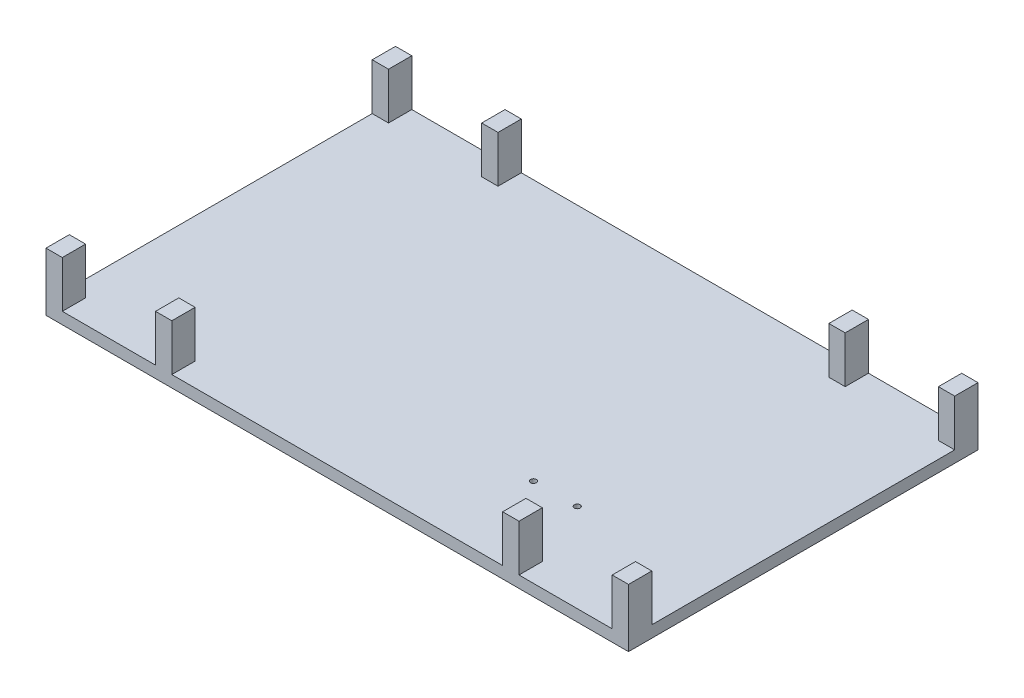
ISO-10303-21;
HEADER;
FILE_DESCRIPTION(('STEP AP214'),'2;1');
FILE_NAME('part.step','',(''),(''),'','','');
FILE_SCHEMA(('AUTOMOTIVE_DESIGN { 1 0 10303 214 1 1 1 1 }'));
ENDSEC;
DATA;
#1=APPLICATION_CONTEXT('core data for automotive mechanical design processes');
#2=APPLICATION_PROTOCOL_DEFINITION('international standard','automotive_design',2000,#1);
#3=PRODUCT_CONTEXT('',#1,'mechanical');
#4=PRODUCT('Part','Part','',(#3));
#5=PRODUCT_RELATED_PRODUCT_CATEGORY('part','',(#4));
#6=PRODUCT_DEFINITION_FORMATION('','',#4);
#7=PRODUCT_DEFINITION_CONTEXT('part definition',#1,'design');
#8=PRODUCT_DEFINITION('design','',#6,#7);
#9=PRODUCT_DEFINITION_SHAPE('','',#8);
#10=(LENGTH_UNIT() NAMED_UNIT(*) SI_UNIT(.MILLI.,.METRE.));
#11=(NAMED_UNIT(*) PLANE_ANGLE_UNIT() SI_UNIT($,.RADIAN.));
#12=(NAMED_UNIT(*) SI_UNIT($,.STERADIAN.) SOLID_ANGLE_UNIT());
#13=UNCERTAINTY_MEASURE_WITH_UNIT(LENGTH_MEASURE(1.E-05),#10,'distance_accuracy_value','');
#14=(GEOMETRIC_REPRESENTATION_CONTEXT(3) GLOBAL_UNCERTAINTY_ASSIGNED_CONTEXT((#13)) GLOBAL_UNIT_ASSIGNED_CONTEXT((#10,
#11,#12)) REPRESENTATION_CONTEXT('',''));
#15=CARTESIAN_POINT('',(0.,0.,0.));
#16=DIRECTION('',(0.,0.,1.));
#17=DIRECTION('',(1.,0.,0.));
#18=AXIS2_PLACEMENT_3D('',#15,#16,#17);
#19=CARTESIAN_POINT('',(0.,5.,0.));
#20=DIRECTION('',(0.,-1.,0.));
#21=DIRECTION('',(0.,0.,-1.));
#22=AXIS2_PLACEMENT_3D('',#19,#20,#21);
#23=PLANE('',#22);
#24=CARTESIAN_POINT('',(46.2,5.,37.));
#25=DIRECTION('',(0.,1.,0.));
#26=DIRECTION('',(0.,0.,1.));
#27=AXIS2_PLACEMENT_3D('',#24,#25,#26);
#28=CIRCLE('',#27,1.25);
#29=CARTESIAN_POINT('',(46.2,5.,38.25));
#30=VERTEX_POINT('',#29);
#31=EDGE_CURVE('E692',#30,#30,#28,.T.);
#32=ORIENTED_EDGE('',*,*,#31,.F.);
#33=EDGE_LOOP('',(#32));
#34=FACE_BOUND('',#33,.T.);
#35=CARTESIAN_POINT('',(65.,5.,37.));
#36=DIRECTION('',(0.,1.,0.));
#37=DIRECTION('',(0.,0.,1.));
#38=AXIS2_PLACEMENT_3D('',#35,#36,#37);
#39=CIRCLE('',#38,1.25);
#40=CARTESIAN_POINT('',(65.,5.,38.25));
#41=VERTEX_POINT('',#40);
#42=EDGE_CURVE('E684',#41,#41,#39,.T.);
#43=ORIENTED_EDGE('',*,*,#42,.F.);
#44=EDGE_LOOP('',(#43));
#45=FACE_BOUND('',#44,.T.);
#46=DIRECTION('',(0.,0.,-1.));
#47=VECTOR('',#46,1.);
#48=CARTESIAN_POINT('',(78.,5.,75.));
#49=LINE('',#48,#47);
#50=CARTESIAN_POINT('',(78.,5.,75.));
#51=VERTEX_POINT('',#50);
#52=CARTESIAN_POINT('',(78.,5.,65.));
#53=VERTEX_POINT('',#52);
#54=EDGE_CURVE('E271',#51,#53,#49,.T.);
#55=ORIENTED_EDGE('',*,*,#54,.F.);
#56=DIRECTION('',(1.,0.,0.));
#57=VECTOR('',#56,1.);
#58=CARTESIAN_POINT('',(125.,5.,75.));
#59=LINE('',#58,#57);
#60=CARTESIAN_POINT('',(118.,5.,75.));
#61=VERTEX_POINT('',#60);
#62=EDGE_CURVE('E540',#51,#61,#59,.T.);
#63=ORIENTED_EDGE('',*,*,#62,.T.);
#64=DIRECTION('',(0.,0.,1.));
#65=VECTOR('',#64,1.);
#66=CARTESIAN_POINT('',(118.,5.,75.));
#67=LINE('',#66,#65);
#68=CARTESIAN_POINT('',(118.,5.,65.));
#69=VERTEX_POINT('',#68);
#70=EDGE_CURVE('E278',#69,#61,#67,.T.);
#71=ORIENTED_EDGE('',*,*,#70,.F.);
#72=DIRECTION('',(-1.,0.,0.));
#73=VECTOR('',#72,1.);
#74=CARTESIAN_POINT('',(125.,5.,65.));
#75=LINE('',#74,#73);
#76=CARTESIAN_POINT('',(125.,5.,65.));
#77=VERTEX_POINT('',#76);
#78=EDGE_CURVE('E273',#77,#69,#75,.T.);
#79=ORIENTED_EDGE('',*,*,#78,.F.);
#80=DIRECTION('',(0.,0.,-1.));
#81=VECTOR('',#80,1.);
#82=CARTESIAN_POINT('',(125.,5.,-75.));
#83=LINE('',#82,#81);
#84=CARTESIAN_POINT('',(125.,5.,-65.));
#85=VERTEX_POINT('',#84);
#86=EDGE_CURVE('E545',#77,#85,#83,.T.);
#87=ORIENTED_EDGE('',*,*,#86,.T.);
#88=DIRECTION('',(1.,0.,0.));
#89=VECTOR('',#88,1.);
#90=CARTESIAN_POINT('',(125.,5.,-65.));
#91=LINE('',#90,#89);
#92=CARTESIAN_POINT('',(118.,5.,-65.));
#93=VERTEX_POINT('',#92);
#94=EDGE_CURVE('E360',#93,#85,#91,.T.);
#95=ORIENTED_EDGE('',*,*,#94,.F.);
#96=DIRECTION('',(0.,0.,1.));
#97=VECTOR('',#96,1.);
#98=CARTESIAN_POINT('',(118.,5.,-75.));
#99=LINE('',#98,#97);
#100=CARTESIAN_POINT('',(118.,5.,-75.));
#101=VERTEX_POINT('',#100);
#102=EDGE_CURVE('E354',#101,#93,#99,.T.);
#103=ORIENTED_EDGE('',*,*,#102,.F.);
#104=DIRECTION('',(-1.,0.,0.));
#105=VECTOR('',#104,1.);
#106=CARTESIAN_POINT('',(125.,5.,-75.));
#107=LINE('',#106,#105);
#108=CARTESIAN_POINT('',(78.,5.,-75.));
#109=VERTEX_POINT('',#108);
#110=EDGE_CURVE('E550',#101,#109,#107,.T.);
#111=ORIENTED_EDGE('',*,*,#110,.T.);
#112=DIRECTION('',(0.,0.,-1.));
#113=VECTOR('',#112,1.);
#114=CARTESIAN_POINT('',(78.,5.,-75.));
#115=LINE('',#114,#113);
#116=CARTESIAN_POINT('',(78.,5.,-65.));
#117=VERTEX_POINT('',#116);
#118=EDGE_CURVE('E313',#117,#109,#115,.T.);
#119=ORIENTED_EDGE('',*,*,#118,.F.);
#120=DIRECTION('',(1.,0.,0.));
#121=VECTOR('',#120,1.);
#122=CARTESIAN_POINT('',(78.,5.,-65.));
#123=LINE('',#122,#121);
#124=CARTESIAN_POINT('',(71.,5.,-65.));
#125=VERTEX_POINT('',#124);
#126=EDGE_CURVE('E319',#125,#117,#123,.T.);
#127=ORIENTED_EDGE('',*,*,#126,.F.);
#128=DIRECTION('',(0.,0.,1.));
#129=VECTOR('',#128,1.);
#130=CARTESIAN_POINT('',(71.,5.,-75.));
#131=LINE('',#130,#129);
#132=CARTESIAN_POINT('',(71.,5.,-75.));
#133=VERTEX_POINT('',#132);
#134=EDGE_CURVE('E332',#133,#125,#131,.T.);
#135=ORIENTED_EDGE('',*,*,#134,.F.);
#136=CARTESIAN_POINT('',(-71.,5.,-75.));
#137=VERTEX_POINT('',#136);
#138=EDGE_CURVE('E554',#133,#137,#107,.T.);
#139=ORIENTED_EDGE('',*,*,#138,.T.);
#140=DIRECTION('',(0.,0.,-1.));
#141=VECTOR('',#140,1.);
#142=CARTESIAN_POINT('',(-71.,5.,-75.));
#143=LINE('',#142,#141);
#144=CARTESIAN_POINT('',(-71.,5.,-65.));
#145=VERTEX_POINT('',#144);
#146=EDGE_CURVE('E393',#145,#137,#143,.T.);
#147=ORIENTED_EDGE('',*,*,#146,.F.);
#148=DIRECTION('',(1.,0.,0.));
#149=VECTOR('',#148,1.);
#150=CARTESIAN_POINT('',(-78.,5.,-64.9999999999999));
#151=LINE('',#150,#149);
#152=CARTESIAN_POINT('',(-78.,5.,-64.9999999999999));
#153=VERTEX_POINT('',#152);
#154=EDGE_CURVE('E406',#153,#145,#151,.T.);
#155=ORIENTED_EDGE('',*,*,#154,.F.);
#156=DIRECTION('',(0.,0.,1.));
#157=VECTOR('',#156,1.);
#158=CARTESIAN_POINT('',(-78.,5.,-75.));
#159=LINE('',#158,#157);
#160=CARTESIAN_POINT('',(-78.,5.,-75.));
#161=VERTEX_POINT('',#160);
#162=EDGE_CURVE('E387',#161,#153,#159,.T.);
#163=ORIENTED_EDGE('',*,*,#162,.F.);
#164=CARTESIAN_POINT('',(-118.,5.,-75.));
#165=VERTEX_POINT('',#164);
#166=EDGE_CURVE('E549',#161,#165,#107,.T.);
#167=ORIENTED_EDGE('',*,*,#166,.T.);
#168=DIRECTION('',(0.,0.,-1.));
#169=VECTOR('',#168,1.);
#170=CARTESIAN_POINT('',(-118.,5.,-75.));
#171=LINE('',#170,#169);
#172=CARTESIAN_POINT('',(-118.,5.,-65.));
#173=VERTEX_POINT('',#172);
#174=EDGE_CURVE('E434',#173,#165,#171,.T.);
#175=ORIENTED_EDGE('',*,*,#174,.F.);
#176=DIRECTION('',(1.,0.,0.));
#177=VECTOR('',#176,1.);
#178=CARTESIAN_POINT('',(-125.,5.,-65.));
#179=LINE('',#178,#177);
#180=CARTESIAN_POINT('',(-125.,5.,-65.));
#181=VERTEX_POINT('',#180);
#182=EDGE_CURVE('E428',#181,#173,#179,.T.);
#183=ORIENTED_EDGE('',*,*,#182,.F.);
#184=DIRECTION('',(0.,0.,1.));
#185=VECTOR('',#184,1.);
#186=CARTESIAN_POINT('',(-125.,5.,-75.));
#187=LINE('',#186,#185);
#188=CARTESIAN_POINT('',(-125.,5.,65.));
#189=VERTEX_POINT('',#188);
#190=EDGE_CURVE('E537',#181,#189,#187,.T.);
#191=ORIENTED_EDGE('',*,*,#190,.T.);
#192=DIRECTION('',(-1.,0.,0.));
#193=VECTOR('',#192,1.);
#194=CARTESIAN_POINT('',(-125.,5.,65.));
#195=LINE('',#194,#193);
#196=CARTESIAN_POINT('',(-118.,5.,65.));
#197=VERTEX_POINT('',#196);
#198=EDGE_CURVE('E509',#197,#189,#195,.T.);
#199=ORIENTED_EDGE('',*,*,#198,.F.);
#200=DIRECTION('',(0.,0.,-1.));
#201=VECTOR('',#200,1.);
#202=CARTESIAN_POINT('',(-118.,5.,75.));
#203=LINE('',#202,#201);
#204=CARTESIAN_POINT('',(-118.,5.,75.));
#205=VERTEX_POINT('',#204);
#206=EDGE_CURVE('E503',#205,#197,#203,.T.);
#207=ORIENTED_EDGE('',*,*,#206,.F.);
#208=CARTESIAN_POINT('',(-78.,5.,75.));
#209=VERTEX_POINT('',#208);
#210=EDGE_CURVE('E542',#205,#209,#59,.T.);
#211=ORIENTED_EDGE('',*,*,#210,.T.);
#212=DIRECTION('',(0.,0.,1.));
#213=VECTOR('',#212,1.);
#214=CARTESIAN_POINT('',(-78.,5.,75.));
#215=LINE('',#214,#213);
#216=CARTESIAN_POINT('',(-78.,5.,65.));
#217=VERTEX_POINT('',#216);
#218=EDGE_CURVE('E462',#217,#209,#215,.T.);
#219=ORIENTED_EDGE('',*,*,#218,.F.);
#220=DIRECTION('',(-1.,0.,0.));
#221=VECTOR('',#220,1.);
#222=CARTESIAN_POINT('',(-78.,5.,65.));
#223=LINE('',#222,#221);
#224=CARTESIAN_POINT('',(-71.,5.,65.));
#225=VERTEX_POINT('',#224);
#226=EDGE_CURVE('E468',#225,#217,#223,.T.);
#227=ORIENTED_EDGE('',*,*,#226,.F.);
#228=DIRECTION('',(0.,0.,-1.));
#229=VECTOR('',#228,1.);
#230=CARTESIAN_POINT('',(-71.,5.,75.));
#231=LINE('',#230,#229);
#232=CARTESIAN_POINT('',(-71.,5.,75.));
#233=VERTEX_POINT('',#232);
#234=EDGE_CURVE('E481',#233,#225,#231,.T.);
#235=ORIENTED_EDGE('',*,*,#234,.F.);
#236=CARTESIAN_POINT('',(71.,5.,75.));
#237=VERTEX_POINT('',#236);
#238=EDGE_CURVE('E546',#233,#237,#59,.T.);
#239=ORIENTED_EDGE('',*,*,#238,.T.);
#240=DIRECTION('',(0.,0.,1.));
#241=VECTOR('',#240,1.);
#242=CARTESIAN_POINT('',(71.,5.,75.));
#243=LINE('',#242,#241);
#244=CARTESIAN_POINT('',(71.,5.,65.));
#245=VERTEX_POINT('',#244);
#246=EDGE_CURVE('E60',#245,#237,#243,.T.);
#247=ORIENTED_EDGE('',*,*,#246,.F.);
#248=DIRECTION('',(-1.,0.,0.));
#249=VECTOR('',#248,1.);
#250=CARTESIAN_POINT('',(78.,5.,65.));
#251=LINE('',#250,#249);
#252=EDGE_CURVE('E55',#53,#245,#251,.T.);
#253=ORIENTED_EDGE('',*,*,#252,.F.);
#254=EDGE_LOOP('',(#55,#63,#71,#79,#87,#95,#103,#111,#119,#127,#135,#139,#147,#155,#163,#167,
#175,#183,#191,#199,#207,#211,#219,#227,#235,#239,#247,#253));
#255=FACE_BOUND('',#254,.T.);
#256=ADVANCED_FACE('F39',(#34,#45,#255),#23,.F.);
#257=CARTESIAN_POINT('',(-125.,5.,-75.));
#258=DIRECTION('',(1.,0.,0.));
#259=DIRECTION('',(0.,0.,-1.));
#260=AXIS2_PLACEMENT_3D('',#257,#258,#259);
#261=PLANE('',#260);
#262=DIRECTION('',(0.,0.,1.));
#263=VECTOR('',#262,1.);
#264=CARTESIAN_POINT('',(-125.,0.,-75.));
#265=LINE('',#264,#263);
#266=CARTESIAN_POINT('',(-125.,0.,-75.));
#267=VERTEX_POINT('',#266);
#268=CARTESIAN_POINT('',(-125.,0.,75.));
#269=VERTEX_POINT('',#268);
#270=EDGE_CURVE('E536',#267,#269,#265,.T.);
#271=ORIENTED_EDGE('',*,*,#270,.T.);
#272=DIRECTION('',(0.,-1.,0.));
#273=VECTOR('',#272,1.);
#274=CARTESIAN_POINT('',(-125.,5.,75.));
#275=LINE('',#274,#273);
#276=CARTESIAN_POINT('',(-125.,25.,75.));
#277=VERTEX_POINT('',#276);
#278=EDGE_CURVE('E11',#277,#269,#275,.T.);
#279=ORIENTED_EDGE('',*,*,#278,.F.);
#280=DIRECTION('',(0.,0.,1.));
#281=VECTOR('',#280,1.);
#282=CARTESIAN_POINT('',(-125.,25.,75.));
#283=LINE('',#282,#281);
#284=CARTESIAN_POINT('',(-125.,25.,65.));
#285=VERTEX_POINT('',#284);
#286=EDGE_CURVE('E504',#285,#277,#283,.T.);
#287=ORIENTED_EDGE('',*,*,#286,.F.);
#288=DIRECTION('',(0.,-1.,0.));
#289=VECTOR('',#288,1.);
#290=CARTESIAN_POINT('',(-125.,25.,65.));
#291=LINE('',#290,#289);
#292=EDGE_CURVE('E518',#285,#189,#291,.T.);
#293=ORIENTED_EDGE('',*,*,#292,.T.);
#294=ORIENTED_EDGE('',*,*,#190,.F.);
#295=DIRECTION('',(0.,-1.,0.));
#296=VECTOR('',#295,1.);
#297=CARTESIAN_POINT('',(-125.,25.,-65.));
#298=LINE('',#297,#296);
#299=CARTESIAN_POINT('',(-125.,25.,-65.));
#300=VERTEX_POINT('',#299);
#301=EDGE_CURVE('E458',#300,#181,#298,.T.);
#302=ORIENTED_EDGE('',*,*,#301,.F.);
#303=DIRECTION('',(0.,0.,1.));
#304=VECTOR('',#303,1.);
#305=CARTESIAN_POINT('',(-125.,25.,-75.));
#306=LINE('',#305,#304);
#307=CARTESIAN_POINT('',(-125.,25.,-75.));
#308=VERTEX_POINT('',#307);
#309=EDGE_CURVE('E429',#308,#300,#306,.T.);
#310=ORIENTED_EDGE('',*,*,#309,.F.);
#311=DIRECTION('',(0.,-1.,0.));
#312=VECTOR('',#311,1.);
#313=CARTESIAN_POINT('',(-125.,5.,-75.));
#314=LINE('',#313,#312);
#315=EDGE_CURVE('E553',#308,#267,#314,.T.);
#316=ORIENTED_EDGE('',*,*,#315,.T.);
#317=EDGE_LOOP('',(#271,#279,#287,#293,#294,#302,#310,#316));
#318=FACE_BOUND('',#317,.T.);
#319=ADVANCED_FACE('F41',(#318),#261,.F.);
#320=CARTESIAN_POINT('',(125.,5.,75.));
#321=DIRECTION('',(0.,0.,-1.));
#322=DIRECTION('',(-1.,0.,0.));
#323=AXIS2_PLACEMENT_3D('',#320,#321,#322);
#324=PLANE('',#323);
#325=DIRECTION('',(1.,0.,0.));
#326=VECTOR('',#325,1.);
#327=CARTESIAN_POINT('',(125.,0.,75.));
#328=LINE('',#327,#326);
#329=CARTESIAN_POINT('',(125.,0.,75.));
#330=VERTEX_POINT('',#329);
#331=EDGE_CURVE('E558',#269,#330,#328,.T.);
#332=ORIENTED_EDGE('',*,*,#331,.T.);
#333=DIRECTION('',(0.,-1.,0.));
#334=VECTOR('',#333,1.);
#335=CARTESIAN_POINT('',(125.,5.,75.));
#336=LINE('',#335,#334);
#337=CARTESIAN_POINT('',(125.,25.,75.));
#338=VERTEX_POINT('',#337);
#339=EDGE_CURVE('E48',#338,#330,#336,.T.);
#340=ORIENTED_EDGE('',*,*,#339,.F.);
#341=DIRECTION('',(1.,0.,0.));
#342=VECTOR('',#341,1.);
#343=CARTESIAN_POINT('',(125.,25.,75.));
#344=LINE('',#343,#342);
#345=CARTESIAN_POINT('',(118.,25.,75.));
#346=VERTEX_POINT('',#345);
#347=EDGE_CURVE('E294',#346,#338,#344,.T.);
#348=ORIENTED_EDGE('',*,*,#347,.F.);
#349=DIRECTION('',(0.,-1.,0.));
#350=VECTOR('',#349,1.);
#351=CARTESIAN_POINT('',(118.,25.,75.));
#352=LINE('',#351,#350);
#353=EDGE_CURVE('E297',#346,#61,#352,.T.);
#354=ORIENTED_EDGE('',*,*,#353,.T.);
#355=ORIENTED_EDGE('',*,*,#62,.F.);
#356=DIRECTION('',(0.,-1.,0.));
#357=VECTOR('',#356,1.);
#358=CARTESIAN_POINT('',(78.,25.,75.));
#359=LINE('',#358,#357);
#360=CARTESIAN_POINT('',(78.,25.,75.));
#361=VERTEX_POINT('',#360);
#362=EDGE_CURVE('E671',#361,#51,#359,.T.);
#363=ORIENTED_EDGE('',*,*,#362,.F.);
#364=DIRECTION('',(1.,0.,0.));
#365=VECTOR('',#364,1.);
#366=CARTESIAN_POINT('',(78.,25.,75.));
#367=LINE('',#366,#365);
#368=CARTESIAN_POINT('',(71.,25.,75.));
#369=VERTEX_POINT('',#368);
#370=EDGE_CURVE('E264',#369,#361,#367,.T.);
#371=ORIENTED_EDGE('',*,*,#370,.F.);
#372=DIRECTION('',(0.,-1.,0.));
#373=VECTOR('',#372,1.);
#374=CARTESIAN_POINT('',(71.,25.,75.));
#375=LINE('',#374,#373);
#376=EDGE_CURVE('E280',#369,#237,#375,.T.);
#377=ORIENTED_EDGE('',*,*,#376,.T.);
#378=ORIENTED_EDGE('',*,*,#238,.F.);
#379=DIRECTION('',(0.,-1.,0.));
#380=VECTOR('',#379,1.);
#381=CARTESIAN_POINT('',(-71.,25.,75.));
#382=LINE('',#381,#380);
#383=CARTESIAN_POINT('',(-71.,25.,75.));
#384=VERTEX_POINT('',#383);
#385=EDGE_CURVE('E495',#384,#233,#382,.T.);
#386=ORIENTED_EDGE('',*,*,#385,.F.);
#387=DIRECTION('',(1.,0.,0.));
#388=VECTOR('',#387,1.);
#389=CARTESIAN_POINT('',(-78.,25.,75.));
#390=LINE('',#389,#388);
#391=CARTESIAN_POINT('',(-78.,25.,75.));
#392=VERTEX_POINT('',#391);
#393=EDGE_CURVE('E467',#392,#384,#390,.T.);
#394=ORIENTED_EDGE('',*,*,#393,.F.);
#395=DIRECTION('',(0.,-1.,0.));
#396=VECTOR('',#395,1.);
#397=CARTESIAN_POINT('',(-78.,25.,75.));
#398=LINE('',#397,#396);
#399=EDGE_CURVE('E499',#392,#209,#398,.T.);
#400=ORIENTED_EDGE('',*,*,#399,.T.);
#401=ORIENTED_EDGE('',*,*,#210,.F.);
#402=DIRECTION('',(0.,-1.,0.));
#403=VECTOR('',#402,1.);
#404=CARTESIAN_POINT('',(-118.,25.,75.));
#405=LINE('',#404,#403);
#406=CARTESIAN_POINT('',(-118.,25.,75.));
#407=VERTEX_POINT('',#406);
#408=EDGE_CURVE('E532',#407,#205,#405,.T.);
#409=ORIENTED_EDGE('',*,*,#408,.F.);
#410=DIRECTION('',(1.,0.,0.));
#411=VECTOR('',#410,1.);
#412=CARTESIAN_POINT('',(-125.,25.,75.));
#413=LINE('',#412,#411);
#414=EDGE_CURVE('E508',#277,#407,#413,.T.);
#415=ORIENTED_EDGE('',*,*,#414,.F.);
#416=ORIENTED_EDGE('',*,*,#278,.T.);
#417=EDGE_LOOP('',(#332,#340,#348,#354,#355,#363,#371,#377,#378,#386,#394,#400,#401,#409,#415,#416));
#418=FACE_BOUND('',#417,.T.);
#419=ADVANCED_FACE('F621',(#418),#324,.F.);
#420=CARTESIAN_POINT('',(125.,5.,-75.));
#421=DIRECTION('',(-1.,0.,0.));
#422=DIRECTION('',(0.,0.,1.));
#423=AXIS2_PLACEMENT_3D('',#420,#421,#422);
#424=PLANE('',#423);
#425=DIRECTION('',(0.,0.,-1.));
#426=VECTOR('',#425,1.);
#427=CARTESIAN_POINT('',(125.,0.,-75.));
#428=LINE('',#427,#426);
#429=CARTESIAN_POINT('',(125.,0.,-75.));
#430=VERTEX_POINT('',#429);
#431=EDGE_CURVE('E561',#330,#430,#428,.T.);
#432=ORIENTED_EDGE('',*,*,#431,.T.);
#433=DIRECTION('',(0.,-1.,0.));
#434=VECTOR('',#433,1.);
#435=CARTESIAN_POINT('',(125.,5.,-75.));
#436=LINE('',#435,#434);
#437=CARTESIAN_POINT('',(125.,25.,-75.));
#438=VERTEX_POINT('',#437);
#439=EDGE_CURVE('E569',#438,#430,#436,.T.);
#440=ORIENTED_EDGE('',*,*,#439,.F.);
#441=DIRECTION('',(0.,0.,-1.));
#442=VECTOR('',#441,1.);
#443=CARTESIAN_POINT('',(125.,25.,-75.));
#444=LINE('',#443,#442);
#445=CARTESIAN_POINT('',(125.,25.,-65.));
#446=VERTEX_POINT('',#445);
#447=EDGE_CURVE('E355',#446,#438,#444,.T.);
#448=ORIENTED_EDGE('',*,*,#447,.F.);
#449=DIRECTION('',(0.,-1.,0.));
#450=VECTOR('',#449,1.);
#451=CARTESIAN_POINT('',(125.,25.,-65.));
#452=LINE('',#451,#450);
#453=EDGE_CURVE('E369',#446,#85,#452,.T.);
#454=ORIENTED_EDGE('',*,*,#453,.T.);
#455=ORIENTED_EDGE('',*,*,#86,.F.);
#456=DIRECTION('',(0.,-1.,0.));
#457=VECTOR('',#456,1.);
#458=CARTESIAN_POINT('',(125.,25.,65.));
#459=LINE('',#458,#457);
#460=CARTESIAN_POINT('',(125.,25.,65.));
#461=VERTEX_POINT('',#460);
#462=EDGE_CURVE('E309',#461,#77,#459,.T.);
#463=ORIENTED_EDGE('',*,*,#462,.F.);
#464=DIRECTION('',(0.,0.,-1.));
#465=VECTOR('',#464,1.);
#466=CARTESIAN_POINT('',(125.,25.,75.));
#467=LINE('',#466,#465);
#468=EDGE_CURVE('E284',#338,#461,#467,.T.);
#469=ORIENTED_EDGE('',*,*,#468,.F.);
#470=ORIENTED_EDGE('',*,*,#339,.T.);
#471=EDGE_LOOP('',(#432,#440,#448,#454,#455,#463,#469,#470));
#472=FACE_BOUND('',#471,.T.);
#473=ADVANCED_FACE('F577',(#472),#424,.F.);
#474=CARTESIAN_POINT('',(125.,5.,-75.));
#475=DIRECTION('',(0.,0.,1.));
#476=DIRECTION('',(1.,0.,0.));
#477=AXIS2_PLACEMENT_3D('',#474,#475,#476);
#478=PLANE('',#477);
#479=DIRECTION('',(-1.,0.,0.));
#480=VECTOR('',#479,1.);
#481=CARTESIAN_POINT('',(125.,0.,-75.));
#482=LINE('',#481,#480);
#483=EDGE_CURVE('E541',#430,#267,#482,.T.);
#484=ORIENTED_EDGE('',*,*,#483,.T.);
#485=ORIENTED_EDGE('',*,*,#315,.F.);
#486=DIRECTION('',(-1.,0.,0.));
#487=VECTOR('',#486,1.);
#488=CARTESIAN_POINT('',(-125.,25.,-75.));
#489=LINE('',#488,#487);
#490=CARTESIAN_POINT('',(-118.,25.,-75.));
#491=VERTEX_POINT('',#490);
#492=EDGE_CURVE('E440',#491,#308,#489,.T.);
#493=ORIENTED_EDGE('',*,*,#492,.F.);
#494=DIRECTION('',(0.,-1.,0.));
#495=VECTOR('',#494,1.);
#496=CARTESIAN_POINT('',(-118.,25.,-75.));
#497=LINE('',#496,#495);
#498=EDGE_CURVE('E444',#491,#165,#497,.T.);
#499=ORIENTED_EDGE('',*,*,#498,.T.);
#500=ORIENTED_EDGE('',*,*,#166,.F.);
#501=DIRECTION('',(0.,-1.,0.));
#502=VECTOR('',#501,1.);
#503=CARTESIAN_POINT('',(-78.,25.,-75.));
#504=LINE('',#503,#502);
#505=CARTESIAN_POINT('',(-78.,25.,-75.));
#506=VERTEX_POINT('',#505);
#507=EDGE_CURVE('E402',#506,#161,#504,.T.);
#508=ORIENTED_EDGE('',*,*,#507,.F.);
#509=DIRECTION('',(-1.,0.,0.));
#510=VECTOR('',#509,1.);
#511=CARTESIAN_POINT('',(-78.,25.,-75.));
#512=LINE('',#511,#510);
#513=CARTESIAN_POINT('',(-71.,25.,-75.));
#514=VERTEX_POINT('',#513);
#515=EDGE_CURVE('E399',#514,#506,#512,.T.);
#516=ORIENTED_EDGE('',*,*,#515,.F.);
#517=DIRECTION('',(0.,-1.,0.));
#518=VECTOR('',#517,1.);
#519=CARTESIAN_POINT('',(-71.,25.,-75.));
#520=LINE('',#519,#518);
#521=EDGE_CURVE('E416',#514,#137,#520,.T.);
#522=ORIENTED_EDGE('',*,*,#521,.T.);
#523=ORIENTED_EDGE('',*,*,#138,.F.);
#524=DIRECTION('',(0.,-1.,0.));
#525=VECTOR('',#524,1.);
#526=CARTESIAN_POINT('',(71.,25.,-75.));
#527=LINE('',#526,#525);
#528=CARTESIAN_POINT('',(71.,25.,-75.));
#529=VERTEX_POINT('',#528);
#530=EDGE_CURVE('E346',#529,#133,#527,.T.);
#531=ORIENTED_EDGE('',*,*,#530,.F.);
#532=DIRECTION('',(-1.,0.,0.));
#533=VECTOR('',#532,1.);
#534=CARTESIAN_POINT('',(78.,25.,-75.));
#535=LINE('',#534,#533);
#536=CARTESIAN_POINT('',(78.,25.,-75.));
#537=VERTEX_POINT('',#536);
#538=EDGE_CURVE('E318',#537,#529,#535,.T.);
#539=ORIENTED_EDGE('',*,*,#538,.F.);
#540=DIRECTION('',(0.,-1.,0.));
#541=VECTOR('',#540,1.);
#542=CARTESIAN_POINT('',(78.,25.,-75.));
#543=LINE('',#542,#541);
#544=EDGE_CURVE('E350',#537,#109,#543,.T.);
#545=ORIENTED_EDGE('',*,*,#544,.T.);
#546=ORIENTED_EDGE('',*,*,#110,.F.);
#547=DIRECTION('',(0.,-1.,0.));
#548=VECTOR('',#547,1.);
#549=CARTESIAN_POINT('',(118.,25.,-75.));
#550=LINE('',#549,#548);
#551=CARTESIAN_POINT('',(118.,25.,-75.));
#552=VERTEX_POINT('',#551);
#553=EDGE_CURVE('E383',#552,#101,#550,.T.);
#554=ORIENTED_EDGE('',*,*,#553,.F.);
#555=DIRECTION('',(-1.,0.,0.));
#556=VECTOR('',#555,1.);
#557=CARTESIAN_POINT('',(125.,25.,-75.));
#558=LINE('',#557,#556);
#559=EDGE_CURVE('E359',#438,#552,#558,.T.);
#560=ORIENTED_EDGE('',*,*,#559,.F.);
#561=ORIENTED_EDGE('',*,*,#439,.T.);
#562=EDGE_LOOP('',(#484,#485,#493,#499,#500,#508,#516,#522,#523,#531,#539,#545,#546,#554,#560,#561));
#563=FACE_BOUND('',#562,.T.);
#564=ADVANCED_FACE('F586',(#563),#478,.F.);
#565=CARTESIAN_POINT('',(0.,0.,0.));
#566=DIRECTION('',(0.,-1.,0.));
#567=DIRECTION('',(0.,0.,-1.));
#568=AXIS2_PLACEMENT_3D('',#565,#566,#567);
#569=PLANE('',#568);
#570=CARTESIAN_POINT('',(46.2,0.,37.));
#571=DIRECTION('',(0.,1.,0.));
#572=DIRECTION('',(0.,0.,1.));
#573=AXIS2_PLACEMENT_3D('',#570,#571,#572);
#574=CIRCLE('',#573,1.25);
#575=CARTESIAN_POINT('',(46.2,0.,38.25));
#576=VERTEX_POINT('',#575);
#577=EDGE_CURVE('E679',#576,#576,#574,.T.);
#578=ORIENTED_EDGE('',*,*,#577,.T.);
#579=EDGE_LOOP('',(#578));
#580=FACE_BOUND('',#579,.T.);
#581=CARTESIAN_POINT('',(65.,0.,37.));
#582=DIRECTION('',(0.,1.,0.));
#583=DIRECTION('',(0.,0.,1.));
#584=AXIS2_PLACEMENT_3D('',#581,#582,#583);
#585=CIRCLE('',#584,1.25);
#586=CARTESIAN_POINT('',(65.,0.,38.25));
#587=VERTEX_POINT('',#586);
#588=EDGE_CURVE('E688',#587,#587,#585,.T.);
#589=ORIENTED_EDGE('',*,*,#588,.T.);
#590=EDGE_LOOP('',(#589));
#591=FACE_BOUND('',#590,.T.);
#592=ORIENTED_EDGE('',*,*,#270,.F.);
#593=ORIENTED_EDGE('',*,*,#483,.F.);
#594=ORIENTED_EDGE('',*,*,#431,.F.);
#595=ORIENTED_EDGE('',*,*,#331,.F.);
#596=EDGE_LOOP('',(#592,#593,#594,#595));
#597=FACE_BOUND('',#596,.T.);
#598=ADVANCED_FACE('F584',(#580,#591,#597),#569,.T.);
#599=CARTESIAN_POINT('',(-118.,25.,75.));
#600=DIRECTION('',(-1.,0.,0.));
#601=DIRECTION('',(0.,0.,1.));
#602=AXIS2_PLACEMENT_3D('',#599,#600,#601);
#603=PLANE('',#602);
#604=ORIENTED_EDGE('',*,*,#206,.T.);
#605=DIRECTION('',(0.,-1.,0.));
#606=VECTOR('',#605,1.);
#607=CARTESIAN_POINT('',(-118.,25.,65.));
#608=LINE('',#607,#606);
#609=CARTESIAN_POINT('',(-118.,25.,65.));
#610=VERTEX_POINT('',#609);
#611=EDGE_CURVE('E528',#610,#197,#608,.T.);
#612=ORIENTED_EDGE('',*,*,#611,.F.);
#613=DIRECTION('',(0.,0.,-1.));
#614=VECTOR('',#613,1.);
#615=CARTESIAN_POINT('',(-118.,25.,75.));
#616=LINE('',#615,#614);
#617=EDGE_CURVE('E512',#407,#610,#616,.T.);
#618=ORIENTED_EDGE('',*,*,#617,.F.);
#619=ORIENTED_EDGE('',*,*,#408,.T.);
#620=EDGE_LOOP('',(#604,#612,#618,#619));
#621=FACE_BOUND('',#620,.T.);
#622=ADVANCED_FACE('F626',(#621),#603,.F.);
#623=CARTESIAN_POINT('',(-125.,25.,65.));
#624=DIRECTION('',(0.,0.,1.));
#625=DIRECTION('',(1.,0.,0.));
#626=AXIS2_PLACEMENT_3D('',#623,#624,#625);
#627=PLANE('',#626);
#628=ORIENTED_EDGE('',*,*,#198,.T.);
#629=ORIENTED_EDGE('',*,*,#292,.F.);
#630=DIRECTION('',(-1.,0.,0.));
#631=VECTOR('',#630,1.);
#632=CARTESIAN_POINT('',(-125.,25.,65.));
#633=LINE('',#632,#631);
#634=EDGE_CURVE('E515',#610,#285,#633,.T.);
#635=ORIENTED_EDGE('',*,*,#634,.F.);
#636=ORIENTED_EDGE('',*,*,#611,.T.);
#637=EDGE_LOOP('',(#628,#629,#635,#636));
#638=FACE_BOUND('',#637,.T.);
#639=ADVANCED_FACE('F647',(#638),#627,.F.);
#640=CARTESIAN_POINT('',(0.,25.,0.));
#641=DIRECTION('',(0.,-1.,0.));
#642=DIRECTION('',(0.,0.,-1.));
#643=AXIS2_PLACEMENT_3D('',#640,#641,#642);
#644=PLANE('',#643);
#645=ORIENTED_EDGE('',*,*,#286,.T.);
#646=ORIENTED_EDGE('',*,*,#414,.T.);
#647=ORIENTED_EDGE('',*,*,#617,.T.);
#648=ORIENTED_EDGE('',*,*,#634,.T.);
#649=EDGE_LOOP('',(#645,#646,#647,#648));
#650=FACE_BOUND('',#649,.T.);
#651=ADVANCED_FACE('F642',(#650),#644,.F.);
#652=CARTESIAN_POINT('',(-78.,25.,75.));
#653=DIRECTION('',(1.,0.,0.));
#654=DIRECTION('',(0.,0.,-1.));
#655=AXIS2_PLACEMENT_3D('',#652,#653,#654);
#656=PLANE('',#655);
#657=ORIENTED_EDGE('',*,*,#218,.T.);
#658=ORIENTED_EDGE('',*,*,#399,.F.);
#659=DIRECTION('',(0.,0.,1.));
#660=VECTOR('',#659,1.);
#661=CARTESIAN_POINT('',(-78.,25.,75.));
#662=LINE('',#661,#660);
#663=CARTESIAN_POINT('',(-78.,25.,65.));
#664=VERTEX_POINT('',#663);
#665=EDGE_CURVE('E463',#664,#392,#662,.T.);
#666=ORIENTED_EDGE('',*,*,#665,.F.);
#667=DIRECTION('',(0.,-1.,0.));
#668=VECTOR('',#667,1.);
#669=CARTESIAN_POINT('',(-78.,25.,65.));
#670=LINE('',#669,#668);
#671=EDGE_CURVE('E477',#664,#217,#670,.T.);
#672=ORIENTED_EDGE('',*,*,#671,.T.);
#673=EDGE_LOOP('',(#657,#658,#666,#672));
#674=FACE_BOUND('',#673,.T.);
#675=ADVANCED_FACE('F658',(#674),#656,.F.);
#676=CARTESIAN_POINT('',(-71.,25.,75.));
#677=DIRECTION('',(-1.,0.,0.));
#678=DIRECTION('',(0.,0.,1.));
#679=AXIS2_PLACEMENT_3D('',#676,#677,#678);
#680=PLANE('',#679);
#681=ORIENTED_EDGE('',*,*,#234,.T.);
#682=DIRECTION('',(0.,-1.,0.));
#683=VECTOR('',#682,1.);
#684=CARTESIAN_POINT('',(-71.,25.,65.));
#685=LINE('',#684,#683);
#686=CARTESIAN_POINT('',(-71.,25.,65.));
#687=VERTEX_POINT('',#686);
#688=EDGE_CURVE('E491',#687,#225,#685,.T.);
#689=ORIENTED_EDGE('',*,*,#688,.F.);
#690=DIRECTION('',(0.,0.,-1.));
#691=VECTOR('',#690,1.);
#692=CARTESIAN_POINT('',(-71.,25.,75.));
#693=LINE('',#692,#691);
#694=EDGE_CURVE('E471',#384,#687,#693,.T.);
#695=ORIENTED_EDGE('',*,*,#694,.F.);
#696=ORIENTED_EDGE('',*,*,#385,.T.);
#697=EDGE_LOOP('',(#681,#689,#695,#696));
#698=FACE_BOUND('',#697,.T.);
#699=ADVANCED_FACE('F662',(#698),#680,.F.);
#700=CARTESIAN_POINT('',(-78.,25.,65.));
#701=DIRECTION('',(0.,0.,1.));
#702=DIRECTION('',(1.,0.,0.));
#703=AXIS2_PLACEMENT_3D('',#700,#701,#702);
#704=PLANE('',#703);
#705=ORIENTED_EDGE('',*,*,#226,.T.);
#706=ORIENTED_EDGE('',*,*,#671,.F.);
#707=DIRECTION('',(-1.,0.,0.));
#708=VECTOR('',#707,1.);
#709=CARTESIAN_POINT('',(-78.,25.,65.));
#710=LINE('',#709,#708);
#711=EDGE_CURVE('E474',#687,#664,#710,.T.);
#712=ORIENTED_EDGE('',*,*,#711,.F.);
#713=ORIENTED_EDGE('',*,*,#688,.T.);
#714=EDGE_LOOP('',(#705,#706,#712,#713));
#715=FACE_BOUND('',#714,.T.);
#716=ADVANCED_FACE('F612',(#715),#704,.F.);
#717=CARTESIAN_POINT('',(0.,25.,0.));
#718=DIRECTION('',(0.,-1.,0.));
#719=DIRECTION('',(0.,0.,-1.));
#720=AXIS2_PLACEMENT_3D('',#717,#718,#719);
#721=PLANE('',#720);
#722=ORIENTED_EDGE('',*,*,#665,.T.);
#723=ORIENTED_EDGE('',*,*,#393,.T.);
#724=ORIENTED_EDGE('',*,*,#694,.T.);
#725=ORIENTED_EDGE('',*,*,#711,.T.);
#726=EDGE_LOOP('',(#722,#723,#724,#725));
#727=FACE_BOUND('',#726,.T.);
#728=ADVANCED_FACE('F605',(#727),#721,.F.);
#729=CARTESIAN_POINT('',(-125.,25.,-65.));
#730=DIRECTION('',(0.,0.,-1.));
#731=DIRECTION('',(-1.,0.,0.));
#732=AXIS2_PLACEMENT_3D('',#729,#730,#731);
#733=PLANE('',#732);
#734=ORIENTED_EDGE('',*,*,#182,.T.);
#735=DIRECTION('',(0.,-1.,0.));
#736=VECTOR('',#735,1.);
#737=CARTESIAN_POINT('',(-118.,25.,-65.));
#738=LINE('',#737,#736);
#739=CARTESIAN_POINT('',(-118.,25.,-65.));
#740=VERTEX_POINT('',#739);
#741=EDGE_CURVE('E454',#740,#173,#738,.T.);
#742=ORIENTED_EDGE('',*,*,#741,.F.);
#743=DIRECTION('',(1.,0.,0.));
#744=VECTOR('',#743,1.);
#745=CARTESIAN_POINT('',(-125.,25.,-65.));
#746=LINE('',#745,#744);
#747=EDGE_CURVE('E433',#300,#740,#746,.T.);
#748=ORIENTED_EDGE('',*,*,#747,.F.);
#749=ORIENTED_EDGE('',*,*,#301,.T.);
#750=EDGE_LOOP('',(#734,#742,#748,#749));
#751=FACE_BOUND('',#750,.T.);
#752=ADVANCED_FACE('F603',(#751),#733,.F.);
#753=CARTESIAN_POINT('',(-118.,25.,-75.));
#754=DIRECTION('',(-1.,0.,0.));
#755=DIRECTION('',(0.,0.,1.));
#756=AXIS2_PLACEMENT_3D('',#753,#754,#755);
#757=PLANE('',#756);
#758=ORIENTED_EDGE('',*,*,#174,.T.);
#759=ORIENTED_EDGE('',*,*,#498,.F.);
#760=DIRECTION('',(0.,0.,-1.));
#761=VECTOR('',#760,1.);
#762=CARTESIAN_POINT('',(-118.,25.,-75.));
#763=LINE('',#762,#761);
#764=EDGE_CURVE('E437',#740,#491,#763,.T.);
#765=ORIENTED_EDGE('',*,*,#764,.F.);
#766=ORIENTED_EDGE('',*,*,#741,.T.);
#767=EDGE_LOOP('',(#758,#759,#765,#766));
#768=FACE_BOUND('',#767,.T.);
#769=ADVANCED_FACE('F601',(#768),#757,.F.);
#770=CARTESIAN_POINT('',(0.,25.,0.));
#771=DIRECTION('',(0.,1.,0.));
#772=DIRECTION('',(0.,0.,1.));
#773=AXIS2_PLACEMENT_3D('',#770,#771,#772);
#774=PLANE('',#773);
#775=ORIENTED_EDGE('',*,*,#309,.T.);
#776=ORIENTED_EDGE('',*,*,#747,.T.);
#777=ORIENTED_EDGE('',*,*,#764,.T.);
#778=ORIENTED_EDGE('',*,*,#492,.T.);
#779=EDGE_LOOP('',(#775,#776,#777,#778));
#780=FACE_BOUND('',#779,.T.);
#781=ADVANCED_FACE('F594',(#780),#774,.T.);
#782=CARTESIAN_POINT('',(-78.,25.,-75.));
#783=DIRECTION('',(1.,0.,0.));
#784=DIRECTION('',(0.,0.,-1.));
#785=AXIS2_PLACEMENT_3D('',#782,#783,#784);
#786=PLANE('',#785);
#787=ORIENTED_EDGE('',*,*,#162,.T.);
#788=DIRECTION('',(0.,-1.,0.));
#789=VECTOR('',#788,1.);
#790=CARTESIAN_POINT('',(-78.,25.,-64.9999999999999));
#791=LINE('',#790,#789);
#792=CARTESIAN_POINT('',(-78.,25.,-64.9999999999999));
#793=VERTEX_POINT('',#792);
#794=EDGE_CURVE('E424',#793,#153,#791,.T.);
#795=ORIENTED_EDGE('',*,*,#794,.F.);
#796=DIRECTION('',(0.,0.,1.));
#797=VECTOR('',#796,1.);
#798=CARTESIAN_POINT('',(-78.,25.,-75.));
#799=LINE('',#798,#797);
#800=EDGE_CURVE('E388',#506,#793,#799,.T.);
#801=ORIENTED_EDGE('',*,*,#800,.F.);
#802=ORIENTED_EDGE('',*,*,#507,.T.);
#803=EDGE_LOOP('',(#787,#795,#801,#802));
#804=FACE_BOUND('',#803,.T.);
#805=ADVANCED_FACE('F771',(#804),#786,.F.);
#806=CARTESIAN_POINT('',(-78.,25.,-64.9999999999999));
#807=DIRECTION('',(0.,0.,-1.));
#808=DIRECTION('',(-1.,0.,0.));
#809=AXIS2_PLACEMENT_3D('',#806,#807,#808);
#810=PLANE('',#809);
#811=ORIENTED_EDGE('',*,*,#154,.T.);
#812=DIRECTION('',(0.,-1.,0.));
#813=VECTOR('',#812,1.);
#814=CARTESIAN_POINT('',(-71.,25.,-65.));
#815=LINE('',#814,#813);
#816=CARTESIAN_POINT('',(-71.,25.,-65.));
#817=VERTEX_POINT('',#816);
#818=EDGE_CURVE('E420',#817,#145,#815,.T.);
#819=ORIENTED_EDGE('',*,*,#818,.F.);
#820=DIRECTION('',(1.,0.,0.));
#821=VECTOR('',#820,1.);
#822=CARTESIAN_POINT('',(-78.,25.,-64.9999999999999));
#823=LINE('',#822,#821);
#824=EDGE_CURVE('E392',#793,#817,#823,.T.);
#825=ORIENTED_EDGE('',*,*,#824,.F.);
#826=ORIENTED_EDGE('',*,*,#794,.T.);
#827=EDGE_LOOP('',(#811,#819,#825,#826));
#828=FACE_BOUND('',#827,.T.);
#829=ADVANCED_FACE('F767',(#828),#810,.F.);
#830=CARTESIAN_POINT('',(-71.,25.,-75.));
#831=DIRECTION('',(-1.,0.,0.));
#832=DIRECTION('',(0.,0.,1.));
#833=AXIS2_PLACEMENT_3D('',#830,#831,#832);
#834=PLANE('',#833);
#835=ORIENTED_EDGE('',*,*,#146,.T.);
#836=ORIENTED_EDGE('',*,*,#521,.F.);
#837=DIRECTION('',(0.,0.,-1.));
#838=VECTOR('',#837,1.);
#839=CARTESIAN_POINT('',(-71.,25.,-75.));
#840=LINE('',#839,#838);
#841=EDGE_CURVE('E396',#817,#514,#840,.T.);
#842=ORIENTED_EDGE('',*,*,#841,.F.);
#843=ORIENTED_EDGE('',*,*,#818,.T.);
#844=EDGE_LOOP('',(#835,#836,#842,#843));
#845=FACE_BOUND('',#844,.T.);
#846=ADVANCED_FACE('F763',(#845),#834,.F.);
#847=CARTESIAN_POINT('',(0.,25.,0.));
#848=DIRECTION('',(0.,1.,0.));
#849=DIRECTION('',(0.,0.,1.));
#850=AXIS2_PLACEMENT_3D('',#847,#848,#849);
#851=PLANE('',#850);
#852=ORIENTED_EDGE('',*,*,#800,.T.);
#853=ORIENTED_EDGE('',*,*,#824,.T.);
#854=ORIENTED_EDGE('',*,*,#841,.T.);
#855=ORIENTED_EDGE('',*,*,#515,.T.);
#856=EDGE_LOOP('',(#852,#853,#854,#855));
#857=FACE_BOUND('',#856,.T.);
#858=ADVANCED_FACE('F759',(#857),#851,.T.);
#859=CARTESIAN_POINT('',(118.,25.,-75.));
#860=DIRECTION('',(1.,0.,0.));
#861=DIRECTION('',(0.,0.,-1.));
#862=AXIS2_PLACEMENT_3D('',#859,#860,#861);
#863=PLANE('',#862);
#864=ORIENTED_EDGE('',*,*,#102,.T.);
#865=DIRECTION('',(0.,-1.,0.));
#866=VECTOR('',#865,1.);
#867=CARTESIAN_POINT('',(118.,25.,-65.));
#868=LINE('',#867,#866);
#869=CARTESIAN_POINT('',(118.,25.,-65.));
#870=VERTEX_POINT('',#869);
#871=EDGE_CURVE('E379',#870,#93,#868,.T.);
#872=ORIENTED_EDGE('',*,*,#871,.F.);
#873=DIRECTION('',(0.,0.,1.));
#874=VECTOR('',#873,1.);
#875=CARTESIAN_POINT('',(118.,25.,-75.));
#876=LINE('',#875,#874);
#877=EDGE_CURVE('E363',#552,#870,#876,.T.);
#878=ORIENTED_EDGE('',*,*,#877,.F.);
#879=ORIENTED_EDGE('',*,*,#553,.T.);
#880=EDGE_LOOP('',(#864,#872,#878,#879));
#881=FACE_BOUND('',#880,.T.);
#882=ADVANCED_FACE('F755',(#881),#863,.F.);
#883=CARTESIAN_POINT('',(125.,25.,-65.));
#884=DIRECTION('',(0.,0.,-1.));
#885=DIRECTION('',(-1.,0.,0.));
#886=AXIS2_PLACEMENT_3D('',#883,#884,#885);
#887=PLANE('',#886);
#888=ORIENTED_EDGE('',*,*,#94,.T.);
#889=ORIENTED_EDGE('',*,*,#453,.F.);
#890=DIRECTION('',(1.,0.,0.));
#891=VECTOR('',#890,1.);
#892=CARTESIAN_POINT('',(125.,25.,-65.));
#893=LINE('',#892,#891);
#894=EDGE_CURVE('E366',#870,#446,#893,.T.);
#895=ORIENTED_EDGE('',*,*,#894,.F.);
#896=ORIENTED_EDGE('',*,*,#871,.T.);
#897=EDGE_LOOP('',(#888,#889,#895,#896));
#898=FACE_BOUND('',#897,.T.);
#899=ADVANCED_FACE('F751',(#898),#887,.F.);
#900=CARTESIAN_POINT('',(0.,25.,0.));
#901=DIRECTION('',(0.,-1.,0.));
#902=DIRECTION('',(0.,0.,-1.));
#903=AXIS2_PLACEMENT_3D('',#900,#901,#902);
#904=PLANE('',#903);
#905=ORIENTED_EDGE('',*,*,#447,.T.);
#906=ORIENTED_EDGE('',*,*,#559,.T.);
#907=ORIENTED_EDGE('',*,*,#877,.T.);
#908=ORIENTED_EDGE('',*,*,#894,.T.);
#909=EDGE_LOOP('',(#905,#906,#907,#908));
#910=FACE_BOUND('',#909,.T.);
#911=ADVANCED_FACE('F747',(#910),#904,.F.);
#912=CARTESIAN_POINT('',(78.,25.,-75.));
#913=DIRECTION('',(-1.,0.,0.));
#914=DIRECTION('',(0.,0.,1.));
#915=AXIS2_PLACEMENT_3D('',#912,#913,#914);
#916=PLANE('',#915);
#917=ORIENTED_EDGE('',*,*,#118,.T.);
#918=ORIENTED_EDGE('',*,*,#544,.F.);
#919=DIRECTION('',(0.,0.,-1.));
#920=VECTOR('',#919,1.);
#921=CARTESIAN_POINT('',(78.,25.,-75.));
#922=LINE('',#921,#920);
#923=CARTESIAN_POINT('',(78.,25.,-65.));
#924=VERTEX_POINT('',#923);
#925=EDGE_CURVE('E314',#924,#537,#922,.T.);
#926=ORIENTED_EDGE('',*,*,#925,.F.);
#927=DIRECTION('',(0.,-1.,0.));
#928=VECTOR('',#927,1.);
#929=CARTESIAN_POINT('',(78.,25.,-65.));
#930=LINE('',#929,#928);
#931=EDGE_CURVE('E328',#924,#117,#930,.T.);
#932=ORIENTED_EDGE('',*,*,#931,.T.);
#933=EDGE_LOOP('',(#917,#918,#926,#932));
#934=FACE_BOUND('',#933,.T.);
#935=ADVANCED_FACE('F743',(#934),#916,.F.);
#936=CARTESIAN_POINT('',(71.,25.,-75.));
#937=DIRECTION('',(1.,0.,0.));
#938=DIRECTION('',(0.,0.,-1.));
#939=AXIS2_PLACEMENT_3D('',#936,#937,#938);
#940=PLANE('',#939);
#941=ORIENTED_EDGE('',*,*,#134,.T.);
#942=DIRECTION('',(0.,-1.,0.));
#943=VECTOR('',#942,1.);
#944=CARTESIAN_POINT('',(71.,25.,-65.));
#945=LINE('',#944,#943);
#946=CARTESIAN_POINT('',(71.,25.,-65.));
#947=VERTEX_POINT('',#946);
#948=EDGE_CURVE('E342',#947,#125,#945,.T.);
#949=ORIENTED_EDGE('',*,*,#948,.F.);
#950=DIRECTION('',(0.,0.,1.));
#951=VECTOR('',#950,1.);
#952=CARTESIAN_POINT('',(71.,25.,-75.));
#953=LINE('',#952,#951);
#954=EDGE_CURVE('E322',#529,#947,#953,.T.);
#955=ORIENTED_EDGE('',*,*,#954,.F.);
#956=ORIENTED_EDGE('',*,*,#530,.T.);
#957=EDGE_LOOP('',(#941,#949,#955,#956));
#958=FACE_BOUND('',#957,.T.);
#959=ADVANCED_FACE('F739',(#958),#940,.F.);
#960=CARTESIAN_POINT('',(78.,25.,-65.));
#961=DIRECTION('',(0.,0.,-1.));
#962=DIRECTION('',(-1.,0.,0.));
#963=AXIS2_PLACEMENT_3D('',#960,#961,#962);
#964=PLANE('',#963);
#965=ORIENTED_EDGE('',*,*,#126,.T.);
#966=ORIENTED_EDGE('',*,*,#931,.F.);
#967=DIRECTION('',(1.,0.,0.));
#968=VECTOR('',#967,1.);
#969=CARTESIAN_POINT('',(78.,25.,-65.));
#970=LINE('',#969,#968);
#971=EDGE_CURVE('E325',#947,#924,#970,.T.);
#972=ORIENTED_EDGE('',*,*,#971,.F.);
#973=ORIENTED_EDGE('',*,*,#948,.T.);
#974=EDGE_LOOP('',(#965,#966,#972,#973));
#975=FACE_BOUND('',#974,.T.);
#976=ADVANCED_FACE('F735',(#975),#964,.F.);
#977=CARTESIAN_POINT('',(0.,25.,0.));
#978=DIRECTION('',(0.,-1.,0.));
#979=DIRECTION('',(0.,0.,-1.));
#980=AXIS2_PLACEMENT_3D('',#977,#978,#979);
#981=PLANE('',#980);
#982=ORIENTED_EDGE('',*,*,#925,.T.);
#983=ORIENTED_EDGE('',*,*,#538,.T.);
#984=ORIENTED_EDGE('',*,*,#954,.T.);
#985=ORIENTED_EDGE('',*,*,#971,.T.);
#986=EDGE_LOOP('',(#982,#983,#984,#985));
#987=FACE_BOUND('',#986,.T.);
#988=ADVANCED_FACE('F731',(#987),#981,.F.);
#989=CARTESIAN_POINT('',(125.,25.,65.));
#990=DIRECTION('',(0.,0.,1.));
#991=DIRECTION('',(1.,0.,0.));
#992=AXIS2_PLACEMENT_3D('',#989,#990,#991);
#993=PLANE('',#992);
#994=ORIENTED_EDGE('',*,*,#78,.T.);
#995=DIRECTION('',(0.,-1.,0.));
#996=VECTOR('',#995,1.);
#997=CARTESIAN_POINT('',(118.,25.,65.));
#998=LINE('',#997,#996);
#999=CARTESIAN_POINT('',(118.,25.,65.));
#1000=VERTEX_POINT('',#999);
#1001=EDGE_CURVE('E305',#1000,#69,#998,.T.);
#1002=ORIENTED_EDGE('',*,*,#1001,.F.);
#1003=DIRECTION('',(-1.,0.,0.));
#1004=VECTOR('',#1003,1.);
#1005=CARTESIAN_POINT('',(125.,25.,65.));
#1006=LINE('',#1005,#1004);
#1007=EDGE_CURVE('E288',#461,#1000,#1006,.T.);
#1008=ORIENTED_EDGE('',*,*,#1007,.F.);
#1009=ORIENTED_EDGE('',*,*,#462,.T.);
#1010=EDGE_LOOP('',(#994,#1002,#1008,#1009));
#1011=FACE_BOUND('',#1010,.T.);
#1012=ADVANCED_FACE('F727',(#1011),#993,.F.);
#1013=CARTESIAN_POINT('',(118.,25.,75.));
#1014=DIRECTION('',(1.,0.,0.));
#1015=DIRECTION('',(0.,0.,-1.));
#1016=AXIS2_PLACEMENT_3D('',#1013,#1014,#1015);
#1017=PLANE('',#1016);
#1018=ORIENTED_EDGE('',*,*,#70,.T.);
#1019=ORIENTED_EDGE('',*,*,#353,.F.);
#1020=DIRECTION('',(0.,0.,1.));
#1021=VECTOR('',#1020,1.);
#1022=CARTESIAN_POINT('',(118.,25.,75.));
#1023=LINE('',#1022,#1021);
#1024=EDGE_CURVE('E291',#1000,#346,#1023,.T.);
#1025=ORIENTED_EDGE('',*,*,#1024,.F.);
#1026=ORIENTED_EDGE('',*,*,#1001,.T.);
#1027=EDGE_LOOP('',(#1018,#1019,#1025,#1026));
#1028=FACE_BOUND('',#1027,.T.);
#1029=ADVANCED_FACE('F723',(#1028),#1017,.F.);
#1030=CARTESIAN_POINT('',(0.,25.,0.));
#1031=DIRECTION('',(0.,1.,0.));
#1032=DIRECTION('',(0.,0.,1.));
#1033=AXIS2_PLACEMENT_3D('',#1030,#1031,#1032);
#1034=PLANE('',#1033);
#1035=ORIENTED_EDGE('',*,*,#468,.T.);
#1036=ORIENTED_EDGE('',*,*,#1007,.T.);
#1037=ORIENTED_EDGE('',*,*,#1024,.T.);
#1038=ORIENTED_EDGE('',*,*,#347,.T.);
#1039=EDGE_LOOP('',(#1035,#1036,#1037,#1038));
#1040=FACE_BOUND('',#1039,.T.);
#1041=ADVANCED_FACE('F720',(#1040),#1034,.T.);
#1042=CARTESIAN_POINT('',(78.,25.,75.));
#1043=DIRECTION('',(-1.,0.,0.));
#1044=DIRECTION('',(0.,0.,1.));
#1045=AXIS2_PLACEMENT_3D('',#1042,#1043,#1044);
#1046=PLANE('',#1045);
#1047=ORIENTED_EDGE('',*,*,#54,.T.);
#1048=DIRECTION('',(0.,-1.,0.));
#1049=VECTOR('',#1048,1.);
#1050=CARTESIAN_POINT('',(78.,25.,65.));
#1051=LINE('',#1050,#1049);
#1052=CARTESIAN_POINT('',(78.,25.,65.));
#1053=VERTEX_POINT('',#1052);
#1054=EDGE_CURVE('E251',#1053,#53,#1051,.T.);
#1055=ORIENTED_EDGE('',*,*,#1054,.F.);
#1056=DIRECTION('',(0.,0.,-1.));
#1057=VECTOR('',#1056,1.);
#1058=CARTESIAN_POINT('',(78.,25.,75.));
#1059=LINE('',#1058,#1057);
#1060=EDGE_CURVE('E259',#361,#1053,#1059,.T.);
#1061=ORIENTED_EDGE('',*,*,#1060,.F.);
#1062=ORIENTED_EDGE('',*,*,#362,.T.);
#1063=EDGE_LOOP('',(#1047,#1055,#1061,#1062));
#1064=FACE_BOUND('',#1063,.T.);
#1065=ADVANCED_FACE('F270',(#1064),#1046,.F.);
#1066=CARTESIAN_POINT('',(78.,25.,65.));
#1067=DIRECTION('',(0.,0.,1.));
#1068=DIRECTION('',(1.,0.,0.));
#1069=AXIS2_PLACEMENT_3D('',#1066,#1067,#1068);
#1070=PLANE('',#1069);
#1071=ORIENTED_EDGE('',*,*,#252,.T.);
#1072=DIRECTION('',(0.,-1.,0.));
#1073=VECTOR('',#1072,1.);
#1074=CARTESIAN_POINT('',(71.,25.,65.));
#1075=LINE('',#1074,#1073);
#1076=CARTESIAN_POINT('',(71.,25.,65.));
#1077=VERTEX_POINT('',#1076);
#1078=EDGE_CURVE('E254',#1077,#245,#1075,.T.);
#1079=ORIENTED_EDGE('',*,*,#1078,.F.);
#1080=DIRECTION('',(-1.,0.,0.));
#1081=VECTOR('',#1080,1.);
#1082=CARTESIAN_POINT('',(78.,25.,65.));
#1083=LINE('',#1082,#1081);
#1084=EDGE_CURVE('E247',#1053,#1077,#1083,.T.);
#1085=ORIENTED_EDGE('',*,*,#1084,.F.);
#1086=ORIENTED_EDGE('',*,*,#1054,.T.);
#1087=EDGE_LOOP('',(#1071,#1079,#1085,#1086));
#1088=FACE_BOUND('',#1087,.T.);
#1089=ADVANCED_FACE('F249',(#1088),#1070,.F.);
#1090=CARTESIAN_POINT('',(71.,25.,75.));
#1091=DIRECTION('',(1.,0.,0.));
#1092=DIRECTION('',(0.,0.,-1.));
#1093=AXIS2_PLACEMENT_3D('',#1090,#1091,#1092);
#1094=PLANE('',#1093);
#1095=ORIENTED_EDGE('',*,*,#246,.T.);
#1096=ORIENTED_EDGE('',*,*,#376,.F.);
#1097=DIRECTION('',(0.,0.,1.));
#1098=VECTOR('',#1097,1.);
#1099=CARTESIAN_POINT('',(71.,25.,75.));
#1100=LINE('',#1099,#1098);
#1101=EDGE_CURVE('E258',#1077,#369,#1100,.T.);
#1102=ORIENTED_EDGE('',*,*,#1101,.F.);
#1103=ORIENTED_EDGE('',*,*,#1078,.T.);
#1104=EDGE_LOOP('',(#1095,#1096,#1102,#1103));
#1105=FACE_BOUND('',#1104,.T.);
#1106=ADVANCED_FACE('F667',(#1105),#1094,.F.);
#1107=CARTESIAN_POINT('',(0.,25.,0.));
#1108=DIRECTION('',(0.,1.,0.));
#1109=DIRECTION('',(0.,0.,1.));
#1110=AXIS2_PLACEMENT_3D('',#1107,#1108,#1109);
#1111=PLANE('',#1110);
#1112=ORIENTED_EDGE('',*,*,#1060,.T.);
#1113=ORIENTED_EDGE('',*,*,#1084,.T.);
#1114=ORIENTED_EDGE('',*,*,#1101,.T.);
#1115=ORIENTED_EDGE('',*,*,#370,.T.);
#1116=EDGE_LOOP('',(#1112,#1113,#1114,#1115));
#1117=FACE_BOUND('',#1116,.T.);
#1118=ADVANCED_FACE('F262',(#1117),#1111,.T.);
#1119=CARTESIAN_POINT('',(65.,0.,37.));
#1120=DIRECTION('',(0.,1.,0.));
#1121=DIRECTION('',(0.,0.,1.));
#1122=AXIS2_PLACEMENT_3D('',#1119,#1120,#1121);
#1123=CYLINDRICAL_SURFACE('',#1122,1.25);
#1124=ORIENTED_EDGE('',*,*,#588,.F.);
#1125=EDGE_LOOP('',(#1124));
#1126=FACE_BOUND('',#1125,.T.);
#1127=ORIENTED_EDGE('',*,*,#42,.T.);
#1128=EDGE_LOOP('',(#1127));
#1129=FACE_BOUND('',#1128,.T.);
#1130=ADVANCED_FACE('F704',(#1126,#1129),#1123,.F.);
#1131=CARTESIAN_POINT('',(46.2,0.,37.));
#1132=DIRECTION('',(0.,1.,0.));
#1133=DIRECTION('',(0.,0.,1.));
#1134=AXIS2_PLACEMENT_3D('',#1131,#1132,#1133);
#1135=CYLINDRICAL_SURFACE('',#1134,1.25);
#1136=ORIENTED_EDGE('',*,*,#577,.F.);
#1137=EDGE_LOOP('',(#1136));
#1138=FACE_BOUND('',#1137,.T.);
#1139=ORIENTED_EDGE('',*,*,#31,.T.);
#1140=EDGE_LOOP('',(#1139));
#1141=FACE_BOUND('',#1140,.T.);
#1142=ADVANCED_FACE('F701',(#1138,#1141),#1135,.F.);
#1143=CLOSED_SHELL('',(#256,#319,#419,#473,#564,#598,#622,#639,#651,#675,#699,#716,#728,#752,
#769,#781,#805,#829,#846,#858,#882,#899,#911,#935,#959,#976,#988,#1012,#1029,#1041,#1065,#1089,
#1106,#1118,#1130,#1142));
#1144=MANIFOLD_SOLID_BREP('B2',#1143);
#1145=ADVANCED_BREP_SHAPE_REPRESENTATION('',(#18,#1144),#14);
#1146=SHAPE_DEFINITION_REPRESENTATION(#9,#1145);
ENDSEC;
END-ISO-10303-21;
